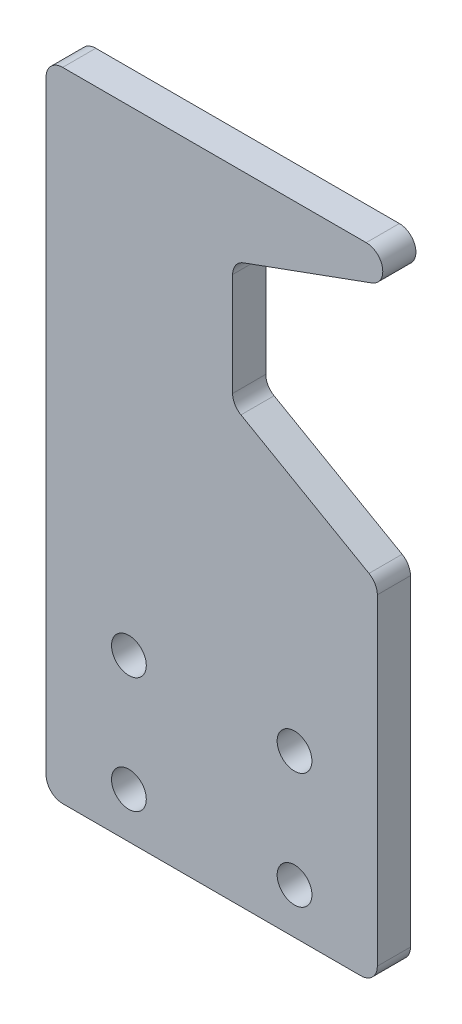
ISO-10303-21;
HEADER;
FILE_DESCRIPTION(('STEP AP214'),'2;1');
FILE_NAME('part.step','',(''),(''),'','','');
FILE_SCHEMA(('AUTOMOTIVE_DESIGN { 1 0 10303 214 1 1 1 1 }'));
ENDSEC;
DATA;
#1=APPLICATION_CONTEXT('core data for automotive mechanical design processes');
#2=APPLICATION_PROTOCOL_DEFINITION('international standard','automotive_design',2000,#1);
#3=PRODUCT_CONTEXT('',#1,'mechanical');
#4=PRODUCT('Part','Part','',(#3));
#5=PRODUCT_RELATED_PRODUCT_CATEGORY('part','',(#4));
#6=PRODUCT_DEFINITION_FORMATION('','',#4);
#7=PRODUCT_DEFINITION_CONTEXT('part definition',#1,'design');
#8=PRODUCT_DEFINITION('design','',#6,#7);
#9=PRODUCT_DEFINITION_SHAPE('','',#8);
#10=(LENGTH_UNIT() NAMED_UNIT(*) SI_UNIT(.MILLI.,.METRE.));
#11=(NAMED_UNIT(*) PLANE_ANGLE_UNIT() SI_UNIT($,.RADIAN.));
#12=(NAMED_UNIT(*) SI_UNIT($,.STERADIAN.) SOLID_ANGLE_UNIT());
#13=UNCERTAINTY_MEASURE_WITH_UNIT(LENGTH_MEASURE(1.E-05),#10,'distance_accuracy_value','');
#14=(GEOMETRIC_REPRESENTATION_CONTEXT(3) GLOBAL_UNCERTAINTY_ASSIGNED_CONTEXT((#13)) GLOBAL_UNIT_ASSIGNED_CONTEXT((#10,
#11,#12)) REPRESENTATION_CONTEXT('',''));
#15=CARTESIAN_POINT('',(0.,0.,0.));
#16=DIRECTION('',(0.,0.,1.));
#17=DIRECTION('',(1.,0.,0.));
#18=AXIS2_PLACEMENT_3D('',#15,#16,#17);
#19=CARTESIAN_POINT('',(0.,0.,4.));
#20=DIRECTION('',(0.,0.,1.));
#21=DIRECTION('',(1.,0.,0.));
#22=AXIS2_PLACEMENT_3D('',#19,#20,#21);
#23=PLANE('',#22);
#24=CARTESIAN_POINT('',(-10.,-15.5,4.));
#25=DIRECTION('',(0.,0.,1.));
#26=DIRECTION('',(1.,0.,0.));
#27=AXIS2_PLACEMENT_3D('',#24,#25,#26);
#28=CIRCLE('',#27,2.1);
#29=CARTESIAN_POINT('',(-7.9,-15.5,4.));
#30=VERTEX_POINT('',#29);
#31=EDGE_CURVE('E487',#30,#30,#28,.T.);
#32=ORIENTED_EDGE('',*,*,#31,.F.);
#33=EDGE_LOOP('',(#32));
#34=FACE_BOUND('',#33,.T.);
#35=CARTESIAN_POINT('',(10.,-15.5,4.));
#36=DIRECTION('',(0.,0.,1.));
#37=DIRECTION('',(1.,0.,0.));
#38=AXIS2_PLACEMENT_3D('',#35,#36,#37);
#39=CIRCLE('',#38,2.1);
#40=CARTESIAN_POINT('',(12.1,-15.5,4.));
#41=VERTEX_POINT('',#40);
#42=EDGE_CURVE('E494',#41,#41,#39,.F.);
#43=ORIENTED_EDGE('',*,*,#42,.T.);
#44=EDGE_LOOP('',(#43));
#45=FACE_BOUND('',#44,.T.);
#46=CARTESIAN_POINT('',(-10.,-1.5,4.));
#47=DIRECTION('',(0.,0.,1.));
#48=DIRECTION('',(1.,0.,0.));
#49=AXIS2_PLACEMENT_3D('',#46,#47,#48);
#50=CIRCLE('',#49,2.1);
#51=CARTESIAN_POINT('',(-7.9,-1.5,4.));
#52=VERTEX_POINT('',#51);
#53=EDGE_CURVE('E481',#52,#52,#50,.T.);
#54=ORIENTED_EDGE('',*,*,#53,.F.);
#55=EDGE_LOOP('',(#54));
#56=FACE_BOUND('',#55,.T.);
#57=DIRECTION('',(1.,0.,0.));
#58=VECTOR('',#57,1.);
#59=CARTESIAN_POINT('',(0.,56.,4.));
#60=LINE('',#59,#58);
#61=CARTESIAN_POINT('',(-17.9999999999999,56.,4.));
#62=VERTEX_POINT('',#61);
#63=CARTESIAN_POINT('',(18.6574363607645,56.,4.));
#64=VERTEX_POINT('',#63);
#65=EDGE_CURVE('E147',#62,#64,#60,.T.);
#66=ORIENTED_EDGE('',*,*,#65,.F.);
#67=CARTESIAN_POINT('',(-17.9999999999999,54.,4.));
#68=DIRECTION('',(0.,0.,1.));
#69=DIRECTION('',(1.,0.,0.));
#70=AXIS2_PLACEMENT_3D('',#67,#68,#69);
#71=CIRCLE('',#70,2.);
#72=CARTESIAN_POINT('',(-19.9999999999999,54.,4.));
#73=VERTEX_POINT('',#72);
#74=EDGE_CURVE('E243',#62,#73,#71,.T.);
#75=ORIENTED_EDGE('',*,*,#74,.T.);
#76=DIRECTION('',(0.,-1.,0.));
#77=VECTOR('',#76,1.);
#78=CARTESIAN_POINT('',(-20.0000000000001,0.,4.));
#79=LINE('',#78,#77);
#80=CARTESIAN_POINT('',(-20.0000000000001,-19.,4.));
#81=VERTEX_POINT('',#80);
#82=EDGE_CURVE('E157',#73,#81,#79,.T.);
#83=ORIENTED_EDGE('',*,*,#82,.T.);
#84=CARTESIAN_POINT('',(-18.0000000000001,-19.,4.));
#85=DIRECTION('',(0.,0.,1.));
#86=DIRECTION('',(1.,0.,0.));
#87=AXIS2_PLACEMENT_3D('',#84,#85,#86);
#88=CIRCLE('',#87,2.);
#89=CARTESIAN_POINT('',(-18.0000000000001,-21.,4.));
#90=VERTEX_POINT('',#89);
#91=EDGE_CURVE('E238',#81,#90,#88,.T.);
#92=ORIENTED_EDGE('',*,*,#91,.T.);
#93=DIRECTION('',(1.,0.,0.));
#94=VECTOR('',#93,1.);
#95=CARTESIAN_POINT('',(0.,-21.,4.));
#96=LINE('',#95,#94);
#97=CARTESIAN_POINT('',(18.,-21.,4.));
#98=VERTEX_POINT('',#97);
#99=EDGE_CURVE('E183',#90,#98,#96,.T.);
#100=ORIENTED_EDGE('',*,*,#99,.T.);
#101=CARTESIAN_POINT('',(18.,-19.,4.));
#102=DIRECTION('',(0.,0.,1.));
#103=DIRECTION('',(1.,0.,0.));
#104=AXIS2_PLACEMENT_3D('',#101,#102,#103);
#105=CIRCLE('',#104,2.);
#106=CARTESIAN_POINT('',(20.,-19.,4.));
#107=VERTEX_POINT('',#106);
#108=EDGE_CURVE('E60',#98,#107,#105,.T.);
#109=ORIENTED_EDGE('',*,*,#108,.T.);
#110=DIRECTION('',(0.,-1.,0.));
#111=VECTOR('',#110,1.);
#112=CARTESIAN_POINT('',(20.,0.,4.));
#113=LINE('',#112,#111);
#114=CARTESIAN_POINT('',(20.,19.8401857425714,4.));
#115=VERTEX_POINT('',#114);
#116=EDGE_CURVE('E185',#115,#107,#113,.T.);
#117=ORIENTED_EDGE('',*,*,#116,.F.);
#118=CARTESIAN_POINT('',(18.,19.8401857425714,4.));
#119=DIRECTION('',(0.,0.,1.));
#120=DIRECTION('',(1.,0.,0.));
#121=AXIS2_PLACEMENT_3D('',#118,#119,#120);
#122=CIRCLE('',#121,2.);
#123=CARTESIAN_POINT('',(18.9933571165922,21.5760548732709,4.));
#124=VERTEX_POINT('',#123);
#125=EDGE_CURVE('E241',#115,#124,#122,.T.);
#126=ORIENTED_EDGE('',*,*,#125,.T.);
#127=DIRECTION('',(0.867934565349766,-0.496678558296121,0.));
#128=VECTOR('',#127,1.);
#129=CARTESIAN_POINT('',(13.9865660663014,24.4412083765725,4.));
#130=LINE('',#129,#128);
#131=CARTESIAN_POINT('',(3.53186868886114,30.4239451267291,4.));
#132=VERTEX_POINT('',#131);
#133=EDGE_CURVE('E187',#132,#124,#130,.T.);
#134=ORIENTED_EDGE('',*,*,#133,.F.);
#135=CARTESIAN_POINT('',(4.52522580545339,32.1598142574286,4.));
#136=DIRECTION('',(0.,0.,1.));
#137=DIRECTION('',(1.,0.,0.));
#138=AXIS2_PLACEMENT_3D('',#135,#136,#137);
#139=CIRCLE('',#138,2.);
#140=CARTESIAN_POINT('',(2.52522580545339,32.1598142574286,4.));
#141=VERTEX_POINT('',#140);
#142=EDGE_CURVE('E11',#132,#141,#139,.F.);
#143=ORIENTED_EDGE('',*,*,#142,.T.);
#144=DIRECTION('',(0.,-1.,0.));
#145=VECTOR('',#144,1.);
#146=CARTESIAN_POINT('',(2.52522580545339,0.,4.));
#147=LINE('',#146,#145);
#148=CARTESIAN_POINT('',(2.52522580545338,44.5995849235806,4.));
#149=VERTEX_POINT('',#148);
#150=EDGE_CURVE('E190',#149,#141,#147,.T.);
#151=ORIENTED_EDGE('',*,*,#150,.F.);
#152=CARTESIAN_POINT('',(4.52522580545339,44.5995849235806,4.));
#153=DIRECTION('',(0.,0.,1.));
#154=DIRECTION('',(1.,0.,0.));
#155=AXIS2_PLACEMENT_3D('',#152,#153,#154);
#156=CIRCLE('',#155,2.);
#157=CARTESIAN_POINT('',(3.84118551880206,46.4789701651524,4.));
#158=VERTEX_POINT('',#157);
#159=EDGE_CURVE('E256',#149,#158,#156,.F.);
#160=ORIENTED_EDGE('',*,*,#159,.T.);
#161=DIRECTION('',(-0.939692620785911,-0.342020143325663,0.));
#162=VECTOR('',#161,1.);
#163=CARTESIAN_POINT('',(-14.4887197180076,39.8074302620336,4.));
#164=LINE('',#163,#162);
#165=CARTESIAN_POINT('',(19.3414766474158,52.1206147584282,4.));
#166=VERTEX_POINT('',#165);
#167=EDGE_CURVE('E171',#166,#158,#164,.T.);
#168=ORIENTED_EDGE('',*,*,#167,.F.);
#169=CARTESIAN_POINT('',(18.6574363607645,54.,4.));
#170=DIRECTION('',(0.,0.,1.));
#171=DIRECTION('',(1.,0.,0.));
#172=AXIS2_PLACEMENT_3D('',#169,#170,#171);
#173=CIRCLE('',#172,2.);
#174=EDGE_CURVE('E158',#64,#166,#173,.F.);
#175=ORIENTED_EDGE('',*,*,#174,.F.);
#176=EDGE_LOOP('',(#66,#75,#83,#92,#100,#109,#117,#126,#134,#143,#151,#160,#168,#175));
#177=FACE_BOUND('',#176,.T.);
#178=CARTESIAN_POINT('',(10.,-1.5,4.));
#179=DIRECTION('',(0.,0.,1.));
#180=DIRECTION('',(1.,0.,0.));
#181=AXIS2_PLACEMENT_3D('',#178,#179,#180);
#182=CIRCLE('',#181,2.1);
#183=CARTESIAN_POINT('',(12.1,-1.5,4.));
#184=VERTEX_POINT('',#183);
#185=EDGE_CURVE('E493',#184,#184,#182,.F.);
#186=ORIENTED_EDGE('',*,*,#185,.T.);
#187=EDGE_LOOP('',(#186));
#188=FACE_BOUND('',#187,.T.);
#189=ADVANCED_FACE('F45',(#34,#45,#56,#177,#188),#23,.T.);
#190=CARTESIAN_POINT('',(0.,0.,0.));
#191=DIRECTION('',(0.,0.,1.));
#192=DIRECTION('',(1.,0.,0.));
#193=AXIS2_PLACEMENT_3D('',#190,#191,#192);
#194=PLANE('',#193);
#195=CARTESIAN_POINT('',(-10.,-15.5,0.));
#196=DIRECTION('',(0.,0.,1.));
#197=DIRECTION('',(1.,0.,0.));
#198=AXIS2_PLACEMENT_3D('',#195,#196,#197);
#199=CIRCLE('',#198,2.1);
#200=CARTESIAN_POINT('',(-7.9,-15.5,0.));
#201=VERTEX_POINT('',#200);
#202=EDGE_CURVE('E485',#201,#201,#199,.F.);
#203=ORIENTED_EDGE('',*,*,#202,.F.);
#204=EDGE_LOOP('',(#203));
#205=FACE_BOUND('',#204,.T.);
#206=CARTESIAN_POINT('',(-10.,-1.5,0.));
#207=DIRECTION('',(0.,0.,1.));
#208=DIRECTION('',(1.,0.,0.));
#209=AXIS2_PLACEMENT_3D('',#206,#207,#208);
#210=CIRCLE('',#209,2.1);
#211=CARTESIAN_POINT('',(-7.9,-1.5,0.));
#212=VERTEX_POINT('',#211);
#213=EDGE_CURVE('E178',#212,#212,#210,.F.);
#214=ORIENTED_EDGE('',*,*,#213,.F.);
#215=EDGE_LOOP('',(#214));
#216=FACE_BOUND('',#215,.T.);
#217=DIRECTION('',(0.,-1.,0.));
#218=VECTOR('',#217,1.);
#219=CARTESIAN_POINT('',(-20.0000000000001,0.,0.));
#220=LINE('',#219,#218);
#221=CARTESIAN_POINT('',(-19.9999999999999,54.,0.));
#222=VERTEX_POINT('',#221);
#223=CARTESIAN_POINT('',(-20.0000000000001,-19.,0.));
#224=VERTEX_POINT('',#223);
#225=EDGE_CURVE('E197',#222,#224,#220,.T.);
#226=ORIENTED_EDGE('',*,*,#225,.F.);
#227=CARTESIAN_POINT('',(-17.9999999999999,54.,0.));
#228=DIRECTION('',(0.,0.,1.));
#229=DIRECTION('',(1.,0.,0.));
#230=AXIS2_PLACEMENT_3D('',#227,#228,#229);
#231=CIRCLE('',#230,2.);
#232=CARTESIAN_POINT('',(-17.9999999999999,56.,0.));
#233=VERTEX_POINT('',#232);
#234=EDGE_CURVE('E235',#222,#233,#231,.F.);
#235=ORIENTED_EDGE('',*,*,#234,.T.);
#236=DIRECTION('',(1.,0.,0.));
#237=VECTOR('',#236,1.);
#238=CARTESIAN_POINT('',(0.,56.,0.));
#239=LINE('',#238,#237);
#240=CARTESIAN_POINT('',(18.6574363607645,56.,0.));
#241=VERTEX_POINT('',#240);
#242=EDGE_CURVE('E195',#233,#241,#239,.T.);
#243=ORIENTED_EDGE('',*,*,#242,.T.);
#244=CARTESIAN_POINT('',(18.6574363607645,54.,0.));
#245=DIRECTION('',(0.,0.,1.));
#246=DIRECTION('',(1.,0.,0.));
#247=AXIS2_PLACEMENT_3D('',#244,#245,#246);
#248=CIRCLE('',#247,2.);
#249=CARTESIAN_POINT('',(19.3414766474158,52.1206147584282,0.));
#250=VERTEX_POINT('',#249);
#251=EDGE_CURVE('E165',#241,#250,#248,.F.);
#252=ORIENTED_EDGE('',*,*,#251,.T.);
#253=DIRECTION('',(-0.939692620785911,-0.342020143325663,0.));
#254=VECTOR('',#253,1.);
#255=CARTESIAN_POINT('',(-14.4887197180076,39.8074302620336,0.));
#256=LINE('',#255,#254);
#257=CARTESIAN_POINT('',(3.84118551880206,46.4789701651524,0.));
#258=VERTEX_POINT('',#257);
#259=EDGE_CURVE('E172',#250,#258,#256,.T.);
#260=ORIENTED_EDGE('',*,*,#259,.T.);
#261=CARTESIAN_POINT('',(4.52522580545339,44.5995849235806,0.));
#262=DIRECTION('',(0.,0.,1.));
#263=DIRECTION('',(1.,0.,0.));
#264=AXIS2_PLACEMENT_3D('',#261,#262,#263);
#265=CIRCLE('',#264,2.);
#266=CARTESIAN_POINT('',(2.52522580545338,44.5995849235806,0.));
#267=VERTEX_POINT('',#266);
#268=EDGE_CURVE('E254',#258,#267,#265,.T.);
#269=ORIENTED_EDGE('',*,*,#268,.T.);
#270=DIRECTION('',(0.,-1.,0.));
#271=VECTOR('',#270,1.);
#272=CARTESIAN_POINT('',(2.52522580545339,0.,0.));
#273=LINE('',#272,#271);
#274=CARTESIAN_POINT('',(2.52522580545339,32.1598142574286,0.));
#275=VERTEX_POINT('',#274);
#276=EDGE_CURVE('E175',#267,#275,#273,.T.);
#277=ORIENTED_EDGE('',*,*,#276,.T.);
#278=CARTESIAN_POINT('',(4.52522580545339,32.1598142574286,0.));
#279=DIRECTION('',(0.,0.,1.));
#280=DIRECTION('',(1.,0.,0.));
#281=AXIS2_PLACEMENT_3D('',#278,#279,#280);
#282=CIRCLE('',#281,2.);
#283=CARTESIAN_POINT('',(3.53186868886114,30.4239451267291,0.));
#284=VERTEX_POINT('',#283);
#285=EDGE_CURVE('E53',#275,#284,#282,.T.);
#286=ORIENTED_EDGE('',*,*,#285,.T.);
#287=DIRECTION('',(0.867934565349766,-0.496678558296121,0.));
#288=VECTOR('',#287,1.);
#289=CARTESIAN_POINT('',(13.9865660663014,24.4412083765725,0.));
#290=LINE('',#289,#288);
#291=CARTESIAN_POINT('',(18.9933571165922,21.5760548732709,0.));
#292=VERTEX_POINT('',#291);
#293=EDGE_CURVE('E206',#284,#292,#290,.T.);
#294=ORIENTED_EDGE('',*,*,#293,.T.);
#295=CARTESIAN_POINT('',(18.,19.8401857425714,0.));
#296=DIRECTION('',(0.,0.,1.));
#297=DIRECTION('',(1.,0.,0.));
#298=AXIS2_PLACEMENT_3D('',#295,#296,#297);
#299=CIRCLE('',#298,2.);
#300=CARTESIAN_POINT('',(20.,19.8401857425714,0.));
#301=VERTEX_POINT('',#300);
#302=EDGE_CURVE('E233',#292,#301,#299,.F.);
#303=ORIENTED_EDGE('',*,*,#302,.T.);
#304=DIRECTION('',(0.,-1.,0.));
#305=VECTOR('',#304,1.);
#306=CARTESIAN_POINT('',(20.,0.,0.));
#307=LINE('',#306,#305);
#308=CARTESIAN_POINT('',(20.,-19.,0.));
#309=VERTEX_POINT('',#308);
#310=EDGE_CURVE('E203',#301,#309,#307,.T.);
#311=ORIENTED_EDGE('',*,*,#310,.T.);
#312=CARTESIAN_POINT('',(18.,-19.,0.));
#313=DIRECTION('',(0.,0.,1.));
#314=DIRECTION('',(1.,0.,0.));
#315=AXIS2_PLACEMENT_3D('',#312,#313,#314);
#316=CIRCLE('',#315,2.);
#317=CARTESIAN_POINT('',(18.,-21.,0.));
#318=VERTEX_POINT('',#317);
#319=EDGE_CURVE('E231',#309,#318,#316,.F.);
#320=ORIENTED_EDGE('',*,*,#319,.T.);
#321=DIRECTION('',(1.,0.,0.));
#322=VECTOR('',#321,1.);
#323=CARTESIAN_POINT('',(0.,-21.,0.));
#324=LINE('',#323,#322);
#325=CARTESIAN_POINT('',(-18.0000000000001,-21.,0.));
#326=VERTEX_POINT('',#325);
#327=EDGE_CURVE('E200',#326,#318,#324,.T.);
#328=ORIENTED_EDGE('',*,*,#327,.F.);
#329=CARTESIAN_POINT('',(-18.0000000000001,-19.,0.));
#330=DIRECTION('',(0.,0.,1.));
#331=DIRECTION('',(1.,0.,0.));
#332=AXIS2_PLACEMENT_3D('',#329,#330,#331);
#333=CIRCLE('',#332,2.);
#334=EDGE_CURVE('E229',#326,#224,#333,.F.);
#335=ORIENTED_EDGE('',*,*,#334,.T.);
#336=EDGE_LOOP('',(#226,#235,#243,#252,#260,#269,#277,#286,#294,#303,#311,#320,#328,#335));
#337=FACE_BOUND('',#336,.T.);
#338=CARTESIAN_POINT('',(10.,-15.5,0.));
#339=DIRECTION('',(0.,0.,1.));
#340=DIRECTION('',(1.,0.,0.));
#341=AXIS2_PLACEMENT_3D('',#338,#339,#340);
#342=CIRCLE('',#341,2.1);
#343=CARTESIAN_POINT('',(12.1,-15.5,0.));
#344=VERTEX_POINT('',#343);
#345=EDGE_CURVE('E499',#344,#344,#342,.T.);
#346=ORIENTED_EDGE('',*,*,#345,.T.);
#347=EDGE_LOOP('',(#346));
#348=FACE_BOUND('',#347,.T.);
#349=CARTESIAN_POINT('',(10.,-1.5,0.));
#350=DIRECTION('',(0.,0.,1.));
#351=DIRECTION('',(1.,0.,0.));
#352=AXIS2_PLACEMENT_3D('',#349,#350,#351);
#353=CIRCLE('',#352,2.1);
#354=CARTESIAN_POINT('',(12.1,-1.5,0.));
#355=VERTEX_POINT('',#354);
#356=EDGE_CURVE('E490',#355,#355,#353,.T.);
#357=ORIENTED_EDGE('',*,*,#356,.T.);
#358=EDGE_LOOP('',(#357));
#359=FACE_BOUND('',#358,.T.);
#360=ADVANCED_FACE('F260',(#205,#216,#337,#348,#359),#194,.F.);
#361=CARTESIAN_POINT('',(18.6574363607645,54.,4.));
#362=DIRECTION('',(0.,0.,-1.));
#363=DIRECTION('',(-1.,0.,0.));
#364=AXIS2_PLACEMENT_3D('',#361,#362,#363);
#365=CYLINDRICAL_SURFACE('',#364,2.);
#366=ORIENTED_EDGE('',*,*,#251,.F.);
#367=DIRECTION('',(0.,0.,-1.));
#368=VECTOR('',#367,1.);
#369=CARTESIAN_POINT('',(18.6574363607645,56.,4.));
#370=LINE('',#369,#368);
#371=EDGE_CURVE('E151',#64,#241,#370,.T.);
#372=ORIENTED_EDGE('',*,*,#371,.F.);
#373=ORIENTED_EDGE('',*,*,#174,.T.);
#374=DIRECTION('',(0.,0.,-1.));
#375=VECTOR('',#374,1.);
#376=CARTESIAN_POINT('',(19.3414766474158,52.1206147584282,4.));
#377=LINE('',#376,#375);
#378=EDGE_CURVE('E167',#166,#250,#377,.T.);
#379=ORIENTED_EDGE('',*,*,#378,.T.);
#380=EDGE_LOOP('',(#366,#372,#373,#379));
#381=FACE_BOUND('',#380,.T.);
#382=ADVANCED_FACE('F162',(#381),#365,.T.);
#383=CARTESIAN_POINT('',(0.,56.,4.));
#384=DIRECTION('',(0.,1.,0.));
#385=DIRECTION('',(-1.,0.,0.));
#386=AXIS2_PLACEMENT_3D('',#383,#384,#385);
#387=PLANE('',#386);
#388=ORIENTED_EDGE('',*,*,#242,.F.);
#389=DIRECTION('',(0.,0.,-1.));
#390=VECTOR('',#389,1.);
#391=CARTESIAN_POINT('',(-17.9999999999999,56.,4.));
#392=LINE('',#391,#390);
#393=EDGE_CURVE('E154',#233,#62,#392,.F.);
#394=ORIENTED_EDGE('',*,*,#393,.T.);
#395=ORIENTED_EDGE('',*,*,#65,.T.);
#396=ORIENTED_EDGE('',*,*,#371,.T.);
#397=EDGE_LOOP('',(#388,#394,#395,#396));
#398=FACE_BOUND('',#397,.T.);
#399=ADVANCED_FACE('F150',(#398),#387,.T.);
#400=CARTESIAN_POINT('',(-20.0000000000001,0.,4.));
#401=DIRECTION('',(1.,0.,0.));
#402=DIRECTION('',(0.,1.,0.));
#403=AXIS2_PLACEMENT_3D('',#400,#401,#402);
#404=PLANE('',#403);
#405=ORIENTED_EDGE('',*,*,#82,.F.);
#406=DIRECTION('',(0.,0.,-1.));
#407=VECTOR('',#406,1.);
#408=CARTESIAN_POINT('',(-19.9999999999999,54.,0.));
#409=LINE('',#408,#407);
#410=EDGE_CURVE('E226',#73,#222,#409,.T.);
#411=ORIENTED_EDGE('',*,*,#410,.T.);
#412=ORIENTED_EDGE('',*,*,#225,.T.);
#413=DIRECTION('',(0.,0.,-1.));
#414=VECTOR('',#413,1.);
#415=CARTESIAN_POINT('',(-20.0000000000001,-19.,4.));
#416=LINE('',#415,#414);
#417=EDGE_CURVE('E224',#224,#81,#416,.F.);
#418=ORIENTED_EDGE('',*,*,#417,.T.);
#419=EDGE_LOOP('',(#405,#411,#412,#418));
#420=FACE_BOUND('',#419,.T.);
#421=ADVANCED_FACE('F289',(#420),#404,.F.);
#422=CARTESIAN_POINT('',(0.,-21.,4.));
#423=DIRECTION('',(0.,1.,0.));
#424=DIRECTION('',(0.,0.,1.));
#425=AXIS2_PLACEMENT_3D('',#422,#423,#424);
#426=PLANE('',#425);
#427=ORIENTED_EDGE('',*,*,#327,.T.);
#428=DIRECTION('',(0.,0.,-1.));
#429=VECTOR('',#428,1.);
#430=CARTESIAN_POINT('',(18.,-21.,4.));
#431=LINE('',#430,#429);
#432=EDGE_CURVE('E252',#318,#98,#431,.F.);
#433=ORIENTED_EDGE('',*,*,#432,.T.);
#434=ORIENTED_EDGE('',*,*,#99,.F.);
#435=DIRECTION('',(0.,0.,-1.));
#436=VECTOR('',#435,1.);
#437=CARTESIAN_POINT('',(-18.0000000000001,-21.,4.));
#438=LINE('',#437,#436);
#439=EDGE_CURVE('E249',#90,#326,#438,.T.);
#440=ORIENTED_EDGE('',*,*,#439,.T.);
#441=EDGE_LOOP('',(#427,#433,#434,#440));
#442=FACE_BOUND('',#441,.T.);
#443=ADVANCED_FACE('F295',(#442),#426,.F.);
#444=CARTESIAN_POINT('',(20.,0.,4.));
#445=DIRECTION('',(1.,0.,0.));
#446=DIRECTION('',(0.,1.,0.));
#447=AXIS2_PLACEMENT_3D('',#444,#445,#446);
#448=PLANE('',#447);
#449=ORIENTED_EDGE('',*,*,#310,.F.);
#450=DIRECTION('',(0.,0.,-1.));
#451=VECTOR('',#450,1.);
#452=CARTESIAN_POINT('',(20.,19.8401857425714,4.));
#453=LINE('',#452,#451);
#454=EDGE_CURVE('E67',#301,#115,#453,.F.);
#455=ORIENTED_EDGE('',*,*,#454,.T.);
#456=ORIENTED_EDGE('',*,*,#116,.T.);
#457=DIRECTION('',(0.,0.,-1.));
#458=VECTOR('',#457,1.);
#459=CARTESIAN_POINT('',(20.,-19.,0.));
#460=LINE('',#459,#458);
#461=EDGE_CURVE('E245',#107,#309,#460,.T.);
#462=ORIENTED_EDGE('',*,*,#461,.T.);
#463=EDGE_LOOP('',(#449,#455,#456,#462));
#464=FACE_BOUND('',#463,.T.);
#465=ADVANCED_FACE('F301',(#464),#448,.T.);
#466=CARTESIAN_POINT('',(13.9865660663014,24.4412083765725,4.));
#467=DIRECTION('',(0.496678558296121,0.867934565349766,0.));
#468=DIRECTION('',(-0.867934565349766,0.496678558296121,0.));
#469=AXIS2_PLACEMENT_3D('',#466,#467,#468);
#470=PLANE('',#469);
#471=ORIENTED_EDGE('',*,*,#293,.F.);
#472=DIRECTION('',(0.,0.,-1.));
#473=VECTOR('',#472,1.);
#474=CARTESIAN_POINT('',(3.53186868886115,30.4239451267291,4.));
#475=LINE('',#474,#473);
#476=EDGE_CURVE('E222',#284,#132,#475,.F.);
#477=ORIENTED_EDGE('',*,*,#476,.T.);
#478=ORIENTED_EDGE('',*,*,#133,.T.);
#479=DIRECTION('',(0.,0.,-1.));
#480=VECTOR('',#479,1.);
#481=CARTESIAN_POINT('',(18.9933571165922,21.5760548732709,4.));
#482=LINE('',#481,#480);
#483=EDGE_CURVE('E219',#124,#292,#482,.T.);
#484=ORIENTED_EDGE('',*,*,#483,.T.);
#485=EDGE_LOOP('',(#471,#477,#478,#484));
#486=FACE_BOUND('',#485,.T.);
#487=ADVANCED_FACE('F267',(#486),#470,.T.);
#488=CARTESIAN_POINT('',(2.52522580545339,0.,4.));
#489=DIRECTION('',(1.,0.,0.));
#490=DIRECTION('',(0.,1.,0.));
#491=AXIS2_PLACEMENT_3D('',#488,#489,#490);
#492=PLANE('',#491);
#493=ORIENTED_EDGE('',*,*,#276,.F.);
#494=DIRECTION('',(0.,0.,-1.));
#495=VECTOR('',#494,1.);
#496=CARTESIAN_POINT('',(2.52522580545338,44.5995849235806,4.));
#497=LINE('',#496,#495);
#498=EDGE_CURVE('E217',#267,#149,#497,.F.);
#499=ORIENTED_EDGE('',*,*,#498,.T.);
#500=ORIENTED_EDGE('',*,*,#150,.T.);
#501=DIRECTION('',(0.,0.,-1.));
#502=VECTOR('',#501,1.);
#503=CARTESIAN_POINT('',(2.52522580545339,32.1598142574286,0.));
#504=LINE('',#503,#502);
#505=EDGE_CURVE('E214',#141,#275,#504,.T.);
#506=ORIENTED_EDGE('',*,*,#505,.T.);
#507=EDGE_LOOP('',(#493,#499,#500,#506));
#508=FACE_BOUND('',#507,.T.);
#509=ADVANCED_FACE('F275',(#508),#492,.T.);
#510=CARTESIAN_POINT('',(-14.4887197180076,39.8074302620336,4.));
#511=DIRECTION('',(0.342020143325663,-0.939692620785911,0.));
#512=DIRECTION('',(0.939692620785911,0.342020143325663,0.));
#513=AXIS2_PLACEMENT_3D('',#510,#511,#512);
#514=PLANE('',#513);
#515=ORIENTED_EDGE('',*,*,#167,.T.);
#516=DIRECTION('',(0.,0.,-1.));
#517=VECTOR('',#516,1.);
#518=CARTESIAN_POINT('',(3.84118551880206,46.4789701651524,0.));
#519=LINE('',#518,#517);
#520=EDGE_CURVE('E166',#158,#258,#519,.T.);
#521=ORIENTED_EDGE('',*,*,#520,.T.);
#522=ORIENTED_EDGE('',*,*,#259,.F.);
#523=ORIENTED_EDGE('',*,*,#378,.F.);
#524=EDGE_LOOP('',(#515,#521,#522,#523));
#525=FACE_BOUND('',#524,.T.);
#526=ADVANCED_FACE('F281',(#525),#514,.T.);
#527=CARTESIAN_POINT('',(-10.,-1.5,-0.00100000000000013));
#528=DIRECTION('',(0.,0.,1.));
#529=DIRECTION('',(1.,0.,0.));
#530=AXIS2_PLACEMENT_3D('',#527,#528,#529);
#531=CYLINDRICAL_SURFACE('',#530,2.1);
#532=ORIENTED_EDGE('',*,*,#53,.T.);
#533=EDGE_LOOP('',(#532));
#534=FACE_BOUND('',#533,.T.);
#535=ORIENTED_EDGE('',*,*,#213,.T.);
#536=EDGE_LOOP('',(#535));
#537=FACE_BOUND('',#536,.T.);
#538=ADVANCED_FACE('F324',(#534,#537),#531,.F.);
#539=CARTESIAN_POINT('',(10.,-15.5,-0.00100000000000013));
#540=DIRECTION('',(0.,0.,1.));
#541=DIRECTION('',(1.,0.,0.));
#542=AXIS2_PLACEMENT_3D('',#539,#540,#541);
#543=CYLINDRICAL_SURFACE('',#542,2.1);
#544=ORIENTED_EDGE('',*,*,#42,.F.);
#545=EDGE_LOOP('',(#544));
#546=FACE_BOUND('',#545,.T.);
#547=ORIENTED_EDGE('',*,*,#345,.F.);
#548=EDGE_LOOP('',(#547));
#549=FACE_BOUND('',#548,.T.);
#550=ADVANCED_FACE('F395',(#546,#549),#543,.F.);
#551=CARTESIAN_POINT('',(10.,-1.5,-0.00100000000000013));
#552=DIRECTION('',(0.,0.,1.));
#553=DIRECTION('',(1.,0.,0.));
#554=AXIS2_PLACEMENT_3D('',#551,#552,#553);
#555=CYLINDRICAL_SURFACE('',#554,2.1);
#556=ORIENTED_EDGE('',*,*,#185,.F.);
#557=EDGE_LOOP('',(#556));
#558=FACE_BOUND('',#557,.T.);
#559=ORIENTED_EDGE('',*,*,#356,.F.);
#560=EDGE_LOOP('',(#559));
#561=FACE_BOUND('',#560,.T.);
#562=ADVANCED_FACE('F386',(#558,#561),#555,.F.);
#563=CARTESIAN_POINT('',(-10.,-15.5,-0.00100000000000013));
#564=DIRECTION('',(0.,0.,1.));
#565=DIRECTION('',(1.,0.,0.));
#566=AXIS2_PLACEMENT_3D('',#563,#564,#565);
#567=CYLINDRICAL_SURFACE('',#566,2.1);
#568=ORIENTED_EDGE('',*,*,#31,.T.);
#569=EDGE_LOOP('',(#568));
#570=FACE_BOUND('',#569,.T.);
#571=ORIENTED_EDGE('',*,*,#202,.T.);
#572=EDGE_LOOP('',(#571));
#573=FACE_BOUND('',#572,.T.);
#574=ADVANCED_FACE('F345',(#570,#573),#567,.F.);
#575=CARTESIAN_POINT('',(4.52522580545339,44.5995849235806,4.));
#576=DIRECTION('',(0.,0.,1.));
#577=DIRECTION('',(1.,0.,0.));
#578=AXIS2_PLACEMENT_3D('',#575,#576,#577);
#579=CYLINDRICAL_SURFACE('',#578,2.);
#580=ORIENTED_EDGE('',*,*,#159,.F.);
#581=ORIENTED_EDGE('',*,*,#498,.F.);
#582=ORIENTED_EDGE('',*,*,#268,.F.);
#583=ORIENTED_EDGE('',*,*,#520,.F.);
#584=EDGE_LOOP('',(#580,#581,#582,#583));
#585=FACE_BOUND('',#584,.T.);
#586=ADVANCED_FACE('F278',(#585),#579,.F.);
#587=CARTESIAN_POINT('',(4.52522580545339,32.1598142574286,4.));
#588=DIRECTION('',(0.,0.,1.));
#589=DIRECTION('',(1.,0.,0.));
#590=AXIS2_PLACEMENT_3D('',#587,#588,#589);
#591=CYLINDRICAL_SURFACE('',#590,2.);
#592=ORIENTED_EDGE('',*,*,#142,.F.);
#593=ORIENTED_EDGE('',*,*,#476,.F.);
#594=ORIENTED_EDGE('',*,*,#285,.F.);
#595=ORIENTED_EDGE('',*,*,#505,.F.);
#596=EDGE_LOOP('',(#592,#593,#594,#595));
#597=FACE_BOUND('',#596,.T.);
#598=ADVANCED_FACE('F271',(#597),#591,.F.);
#599=CARTESIAN_POINT('',(-17.9999999999999,54.,4.));
#600=DIRECTION('',(0.,0.,1.));
#601=DIRECTION('',(1.,0.,0.));
#602=AXIS2_PLACEMENT_3D('',#599,#600,#601);
#603=CYLINDRICAL_SURFACE('',#602,2.);
#604=ORIENTED_EDGE('',*,*,#74,.F.);
#605=ORIENTED_EDGE('',*,*,#393,.F.);
#606=ORIENTED_EDGE('',*,*,#234,.F.);
#607=ORIENTED_EDGE('',*,*,#410,.F.);
#608=EDGE_LOOP('',(#604,#605,#606,#607));
#609=FACE_BOUND('',#608,.T.);
#610=ADVANCED_FACE('F284',(#609),#603,.T.);
#611=CARTESIAN_POINT('',(18.,19.8401857425714,4.));
#612=DIRECTION('',(0.,0.,-1.));
#613=DIRECTION('',(-1.,0.,0.));
#614=AXIS2_PLACEMENT_3D('',#611,#612,#613);
#615=CYLINDRICAL_SURFACE('',#614,2.);
#616=ORIENTED_EDGE('',*,*,#125,.F.);
#617=ORIENTED_EDGE('',*,*,#454,.F.);
#618=ORIENTED_EDGE('',*,*,#302,.F.);
#619=ORIENTED_EDGE('',*,*,#483,.F.);
#620=EDGE_LOOP('',(#616,#617,#618,#619));
#621=FACE_BOUND('',#620,.T.);
#622=ADVANCED_FACE('F304',(#621),#615,.T.);
#623=CARTESIAN_POINT('',(18.,-19.,4.));
#624=DIRECTION('',(0.,0.,1.));
#625=DIRECTION('',(1.,0.,0.));
#626=AXIS2_PLACEMENT_3D('',#623,#624,#625);
#627=CYLINDRICAL_SURFACE('',#626,2.);
#628=ORIENTED_EDGE('',*,*,#108,.F.);
#629=ORIENTED_EDGE('',*,*,#432,.F.);
#630=ORIENTED_EDGE('',*,*,#319,.F.);
#631=ORIENTED_EDGE('',*,*,#461,.F.);
#632=EDGE_LOOP('',(#628,#629,#630,#631));
#633=FACE_BOUND('',#632,.T.);
#634=ADVANCED_FACE('F299',(#633),#627,.T.);
#635=CARTESIAN_POINT('',(-18.0000000000001,-19.,4.));
#636=DIRECTION('',(0.,0.,-1.));
#637=DIRECTION('',(-1.,0.,0.));
#638=AXIS2_PLACEMENT_3D('',#635,#636,#637);
#639=CYLINDRICAL_SURFACE('',#638,2.);
#640=ORIENTED_EDGE('',*,*,#91,.F.);
#641=ORIENTED_EDGE('',*,*,#417,.F.);
#642=ORIENTED_EDGE('',*,*,#334,.F.);
#643=ORIENTED_EDGE('',*,*,#439,.F.);
#644=EDGE_LOOP('',(#640,#641,#642,#643));
#645=FACE_BOUND('',#644,.T.);
#646=ADVANCED_FACE('F47',(#645),#639,.T.);
#647=CLOSED_SHELL('',(#189,#360,#382,#399,#421,#443,#465,#487,#509,#526,#538,#550,#562,#574,
#586,#598,#610,#622,#634,#646));
#648=MANIFOLD_SOLID_BREP('B2',#647);
#649=ADVANCED_BREP_SHAPE_REPRESENTATION('',(#18,#648),#14);
#650=SHAPE_DEFINITION_REPRESENTATION(#9,#649);
ENDSEC;
END-ISO-10303-21;
